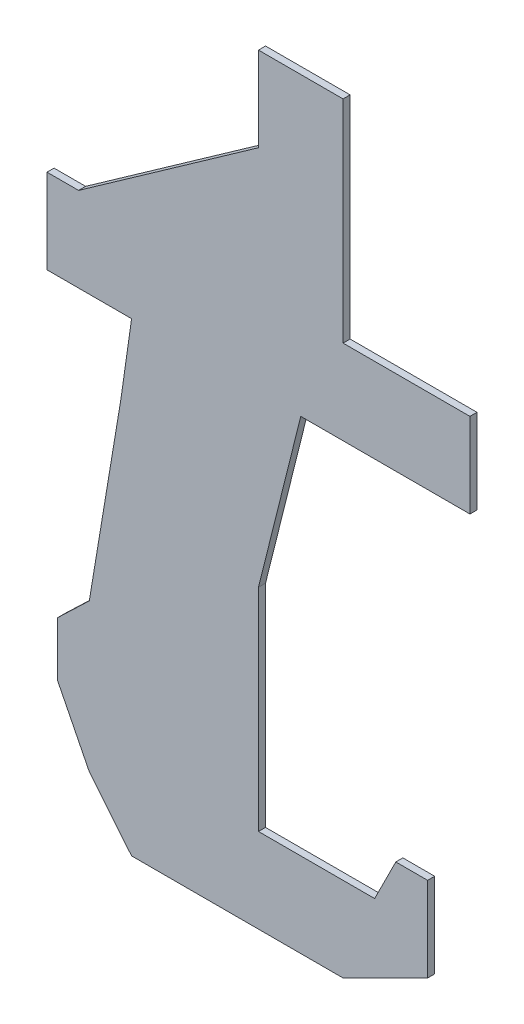
ISO-10303-21;
HEADER;
FILE_DESCRIPTION(('STEP AP214'),'2;1');
FILE_NAME('part.step','',(''),(''),'','','');
FILE_SCHEMA(('AUTOMOTIVE_DESIGN { 1 0 10303 214 1 1 1 1 }'));
ENDSEC;
DATA;
#1=APPLICATION_CONTEXT('core data for automotive mechanical design processes');
#2=APPLICATION_PROTOCOL_DEFINITION('international standard','automotive_design',2000,#1);
#3=PRODUCT_CONTEXT('',#1,'mechanical');
#4=PRODUCT('Part','Part','',(#3));
#5=PRODUCT_RELATED_PRODUCT_CATEGORY('part','',(#4));
#6=PRODUCT_DEFINITION_FORMATION('','',#4);
#7=PRODUCT_DEFINITION_CONTEXT('part definition',#1,'design');
#8=PRODUCT_DEFINITION('design','',#6,#7);
#9=PRODUCT_DEFINITION_SHAPE('','',#8);
#10=(LENGTH_UNIT() NAMED_UNIT(*) SI_UNIT(.MILLI.,.METRE.));
#11=(NAMED_UNIT(*) PLANE_ANGLE_UNIT() SI_UNIT($,.RADIAN.));
#12=(NAMED_UNIT(*) SI_UNIT($,.STERADIAN.) SOLID_ANGLE_UNIT());
#13=UNCERTAINTY_MEASURE_WITH_UNIT(LENGTH_MEASURE(1.E-05),#10,'distance_accuracy_value','');
#14=(GEOMETRIC_REPRESENTATION_CONTEXT(3) GLOBAL_UNCERTAINTY_ASSIGNED_CONTEXT((#13)) GLOBAL_UNIT_ASSIGNED_CONTEXT((#10,
#11,#12)) REPRESENTATION_CONTEXT('',''));
#15=CARTESIAN_POINT('',(0.,0.,0.));
#16=DIRECTION('',(0.,0.,1.));
#17=DIRECTION('',(1.,0.,0.));
#18=AXIS2_PLACEMENT_3D('',#15,#16,#17);
#19=CARTESIAN_POINT('',(-0.2999994,0.24000206,0.01));
#20=DIRECTION('',(0.,0.,-1.));
#21=DIRECTION('',(-1.,0.,0.));
#22=AXIS2_PLACEMENT_3D('',#19,#20,#21);
#23=PLANE('',#22);
#24=DIRECTION('',(1.,0.,0.));
#25=VECTOR('',#24,1.);
#26=CARTESIAN_POINT('',(-0.17999964,0.1200023,0.01));
#27=LINE('',#26,#25);
#28=CARTESIAN_POINT('',(-0.179999639999993,0.120002299999999,0.01));
#29=VERTEX_POINT('',#28);
#30=CARTESIAN_POINT('',(-0.2999994,0.1200023,0.01));
#31=VERTEX_POINT('',#30);
#32=EDGE_CURVE('E299',#29,#31,#27,.F.);
#33=ORIENTED_EDGE('',*,*,#32,.F.);
#34=DIRECTION('',(-0.140896511006019,-0.990024329593132,0.));
#35=VECTOR('',#34,1.);
#36=CARTESIAN_POINT('',(-0.19517868,0.01334516,0.01));
#37=LINE('',#36,#35);
#38=CARTESIAN_POINT('',(-0.195178679999948,0.0133451599999928,0.01));
#39=VERTEX_POINT('',#38);
#40=EDGE_CURVE('E294',#39,#29,#37,.F.);
#41=ORIENTED_EDGE('',*,*,#40,.F.);
#42=DIRECTION('',(-0.163760866877965,-0.98650006511879,0.));
#43=VECTOR('',#42,1.);
#44=CARTESIAN_POINT('',(-0.23999952,-0.25665684,0.01));
#45=LINE('',#44,#43);
#46=CARTESIAN_POINT('',(-0.239999519999992,-0.256656840000009,0.01));
#47=VERTEX_POINT('',#46);
#48=EDGE_CURVE('E289',#47,#39,#45,.F.);
#49=ORIENTED_EDGE('',*,*,#48,.F.);
#50=DIRECTION('',(-0.721641037230073,-0.69226744354007,0.));
#51=VECTOR('',#50,1.);
#52=CARTESIAN_POINT('',(-0.2851785,-0.29999686,0.01));
#53=LINE('',#52,#51);
#54=CARTESIAN_POINT('',(-0.2851785,-0.29999686,0.01));
#55=VERTEX_POINT('',#54);
#56=EDGE_CURVE('E284',#55,#47,#53,.F.);
#57=ORIENTED_EDGE('',*,*,#56,.F.);
#58=DIRECTION('',(0.,1.,0.));
#59=VECTOR('',#58,1.);
#60=CARTESIAN_POINT('',(-0.2851785,-0.3766566,0.01));
#61=LINE('',#60,#59);
#62=CARTESIAN_POINT('',(-0.285178500000013,-0.376656600000007,0.01));
#63=VERTEX_POINT('',#62);
#64=EDGE_CURVE('E279',#63,#55,#61,.T.);
#65=ORIENTED_EDGE('',*,*,#64,.F.);
#66=DIRECTION('',(0.448635588317927,-0.893714780505855,0.));
#67=VECTOR('',#66,1.);
#68=CARTESIAN_POINT('',(-0.23999952,-0.46665642,0.01));
#69=LINE('',#68,#67);
#70=CARTESIAN_POINT('',(-0.239999519999991,-0.466656419999993,0.01));
#71=VERTEX_POINT('',#70);
#72=EDGE_CURVE('E274',#71,#63,#69,.F.);
#73=ORIENTED_EDGE('',*,*,#72,.F.);
#74=DIRECTION('',(0.63318961950418,-0.773996709135221,0.));
#75=VECTOR('',#74,1.);
#76=CARTESIAN_POINT('',(-0.17999964,-0.53999892,0.01));
#77=LINE('',#76,#75);
#78=CARTESIAN_POINT('',(-0.17999964,-0.53999892,0.01));
#79=VERTEX_POINT('',#78);
#80=EDGE_CURVE('E269',#79,#71,#77,.F.);
#81=ORIENTED_EDGE('',*,*,#80,.F.);
#82=DIRECTION('',(1.,0.,0.));
#83=VECTOR('',#82,1.);
#84=CARTESIAN_POINT('',(0.11999976,-0.53999892,0.01));
#85=LINE('',#84,#83);
#86=CARTESIAN_POINT('',(0.119999759999993,-0.539998919999986,0.01));
#87=VERTEX_POINT('',#86);
#88=EDGE_CURVE('E264',#87,#79,#85,.F.);
#89=ORIENTED_EDGE('',*,*,#88,.F.);
#90=DIRECTION('',(0.894430977319859,0.447206022779929,0.));
#91=VECTOR('',#90,1.);
#92=CARTESIAN_POINT('',(0.24000206,-0.47999904,0.01));
#93=LINE('',#92,#91);
#94=CARTESIAN_POINT('',(0.24000206,-0.47999904,0.01));
#95=VERTEX_POINT('',#94);
#96=EDGE_CURVE('E259',#95,#87,#93,.F.);
#97=ORIENTED_EDGE('',*,*,#96,.F.);
#98=DIRECTION('',(0.,1.,0.));
#99=VECTOR('',#98,1.);
#100=CARTESIAN_POINT('',(0.24000206,-0.35999928,0.01));
#101=LINE('',#100,#99);
#102=CARTESIAN_POINT('',(0.24000206,-0.35999928,0.01));
#103=VERTEX_POINT('',#102);
#104=EDGE_CURVE('E254',#103,#95,#101,.F.);
#105=ORIENTED_EDGE('',*,*,#104,.F.);
#106=DIRECTION('',(1.,0.,0.));
#107=VECTOR('',#106,1.);
#108=CARTESIAN_POINT('',(0.19482054,-0.35999928,0.01));
#109=LINE('',#108,#107);
#110=CARTESIAN_POINT('',(0.19482054,-0.35999928,0.01));
#111=VERTEX_POINT('',#110);
#112=EDGE_CURVE('E249',#111,#103,#109,.T.);
#113=ORIENTED_EDGE('',*,*,#112,.F.);
#114=DIRECTION('',(-0.447213595499958,-0.894427190999916,0.));
#115=VECTOR('',#114,1.);
#116=CARTESIAN_POINT('',(0.1648206,-0.41999916,0.01));
#117=LINE('',#116,#115);
#118=CARTESIAN_POINT('',(0.1648206,-0.41999916,0.01));
#119=VERTEX_POINT('',#118);
#120=EDGE_CURVE('E244',#119,#111,#117,.F.);
#121=ORIENTED_EDGE('',*,*,#120,.F.);
#122=DIRECTION('',(1.,0.,0.));
#123=VECTOR('',#122,1.);
#124=CARTESIAN_POINT('',(0.,-0.41999916,0.01));
#125=LINE('',#124,#123);
#126=CARTESIAN_POINT('',(0.,-0.41999916,0.01));
#127=VERTEX_POINT('',#126);
#128=EDGE_CURVE('E239',#127,#119,#125,.T.);
#129=ORIENTED_EDGE('',*,*,#128,.F.);
#130=DIRECTION('',(0.,1.,0.));
#131=VECTOR('',#130,1.);
#132=CARTESIAN_POINT('',(0.,-0.11999722,0.01));
#133=LINE('',#132,#131);
#134=CARTESIAN_POINT('',(0.,-0.119997220000006,0.01));
#135=VERTEX_POINT('',#134);
#136=EDGE_CURVE('E234',#135,#127,#133,.F.);
#137=ORIENTED_EDGE('',*,*,#136,.F.);
#138=DIRECTION('',(0.242535625036098,0.970142500145391,0.));
#139=VECTOR('',#138,1.);
#140=CARTESIAN_POINT('',(0.05999987999999,0.1200023,0.01));
#141=LINE('',#140,#139);
#142=CARTESIAN_POINT('',(0.05999987999999,0.1200023,0.01));
#143=VERTEX_POINT('',#142);
#144=EDGE_CURVE('E229',#143,#135,#141,.F.);
#145=ORIENTED_EDGE('',*,*,#144,.F.);
#146=DIRECTION('',(1.,0.,0.));
#147=VECTOR('',#146,1.);
#148=CARTESIAN_POINT('',(0.30000194,0.1200023,0.01));
#149=LINE('',#148,#147);
#150=CARTESIAN_POINT('',(0.30000194,0.1200023,0.01));
#151=VERTEX_POINT('',#150);
#152=EDGE_CURVE('E224',#151,#143,#149,.F.);
#153=ORIENTED_EDGE('',*,*,#152,.F.);
#154=DIRECTION('',(0.,1.,0.));
#155=VECTOR('',#154,1.);
#156=CARTESIAN_POINT('',(0.30000194,0.24000206,0.01));
#157=LINE('',#156,#155);
#158=CARTESIAN_POINT('',(0.30000194,0.24000206,0.01));
#159=VERTEX_POINT('',#158);
#160=EDGE_CURVE('E219',#159,#151,#157,.F.);
#161=ORIENTED_EDGE('',*,*,#160,.F.);
#162=DIRECTION('',(1.,0.,0.));
#163=VECTOR('',#162,1.);
#164=CARTESIAN_POINT('',(0.11999976,0.24000206,0.01));
#165=LINE('',#164,#163);
#166=CARTESIAN_POINT('',(0.11999976,0.24000206,0.01));
#167=VERTEX_POINT('',#166);
#168=EDGE_CURVE('E214',#167,#159,#165,.T.);
#169=ORIENTED_EDGE('',*,*,#168,.F.);
#170=DIRECTION('',(0.,1.,0.));
#171=VECTOR('',#170,1.);
#172=CARTESIAN_POINT('',(0.11999976,0.54000146,0.01));
#173=LINE('',#172,#171);
#174=CARTESIAN_POINT('',(0.11999976,0.54000146,0.01));
#175=VERTEX_POINT('',#174);
#176=EDGE_CURVE('E209',#175,#167,#173,.F.);
#177=ORIENTED_EDGE('',*,*,#176,.F.);
#178=DIRECTION('',(1.,0.,0.));
#179=VECTOR('',#178,1.);
#180=CARTESIAN_POINT('',(0.,0.54000146,0.01));
#181=LINE('',#180,#179);
#182=CARTESIAN_POINT('',(0.,0.54000146,0.01));
#183=VERTEX_POINT('',#182);
#184=EDGE_CURVE('E204',#183,#175,#181,.T.);
#185=ORIENTED_EDGE('',*,*,#184,.F.);
#186=DIRECTION('',(0.,1.,0.));
#187=VECTOR('',#186,1.);
#188=CARTESIAN_POINT('',(0.,0.4200017,0.01));
#189=LINE('',#188,#187);
#190=CARTESIAN_POINT('',(0.,0.42000169999992,0.01));
#191=VERTEX_POINT('',#190);
#192=EDGE_CURVE('E190',#191,#183,#189,.T.);
#193=ORIENTED_EDGE('',*,*,#192,.F.);
#194=DIRECTION('',(-0.817158522488972,-0.57641300221598,0.));
#195=VECTOR('',#194,1.);
#196=CARTESIAN_POINT('',(-0.25517856,0.24000206,0.01));
#197=LINE('',#196,#195);
#198=CARTESIAN_POINT('',(-0.25517856,0.24000206,0.01));
#199=VERTEX_POINT('',#198);
#200=EDGE_CURVE('E175',#199,#191,#197,.F.);
#201=ORIENTED_EDGE('',*,*,#200,.F.);
#202=DIRECTION('',(1.,0.,0.));
#203=VECTOR('',#202,1.);
#204=CARTESIAN_POINT('',(-0.2999994,0.24000206,0.01));
#205=LINE('',#204,#203);
#206=CARTESIAN_POINT('',(-0.2999994,0.24000206,0.01));
#207=VERTEX_POINT('',#206);
#208=EDGE_CURVE('E20',#207,#199,#205,.T.);
#209=ORIENTED_EDGE('',*,*,#208,.F.);
#210=DIRECTION('',(0.,1.,0.));
#211=VECTOR('',#210,1.);
#212=CARTESIAN_POINT('',(-0.2999994,0.1200023,0.01));
#213=LINE('',#212,#211);
#214=EDGE_CURVE('E302',#31,#207,#213,.T.);
#215=ORIENTED_EDGE('',*,*,#214,.F.);
#216=EDGE_LOOP('',(#33,#41,#49,#57,#65,#73,#81,#89,#97,#105,#113,#121,#129,#137,#145,#153,#161,
#169,#177,#185,#193,#201,#209,#215));
#217=FACE_BOUND('',#216,.T.);
#218=ADVANCED_FACE('F17',(#217),#23,.F.);
#219=CARTESIAN_POINT('',(-0.2999994,0.24000206,0.));
#220=DIRECTION('',(0.,1.,0.));
#221=DIRECTION('',(0.,0.,1.));
#222=AXIS2_PLACEMENT_3D('',#219,#220,#221);
#223=PLANE('',#222);
#224=DIRECTION('',(0.,0.,1.));
#225=VECTOR('',#224,1.);
#226=CARTESIAN_POINT('',(-0.25517856,0.24000206,0.));
#227=LINE('',#226,#225);
#228=CARTESIAN_POINT('',(-0.25517856,0.24000206,0.));
#229=VERTEX_POINT('',#228);
#230=EDGE_CURVE('E181',#229,#199,#227,.T.);
#231=ORIENTED_EDGE('',*,*,#230,.F.);
#232=DIRECTION('',(-1.,0.,0.));
#233=VECTOR('',#232,1.);
#234=CARTESIAN_POINT('',(-0.2999994,0.24000206,0.));
#235=LINE('',#234,#233);
#236=CARTESIAN_POINT('',(-0.2999994,0.24000206,0.));
#237=VERTEX_POINT('',#236);
#238=EDGE_CURVE('E305',#237,#229,#235,.F.);
#239=ORIENTED_EDGE('',*,*,#238,.F.);
#240=DIRECTION('',(0.,0.,1.));
#241=VECTOR('',#240,1.);
#242=CARTESIAN_POINT('',(-0.2999994,0.24000206,0.));
#243=LINE('',#242,#241);
#244=EDGE_CURVE('E184',#207,#237,#243,.F.);
#245=ORIENTED_EDGE('',*,*,#244,.F.);
#246=ORIENTED_EDGE('',*,*,#208,.T.);
#247=EDGE_LOOP('',(#231,#239,#245,#246));
#248=FACE_BOUND('',#247,.T.);
#249=ADVANCED_FACE('F180',(#248),#223,.T.);
#250=CARTESIAN_POINT('',(-0.25517856,0.24000206,0.));
#251=DIRECTION('',(-0.57641300221598,0.817158522488972,0.));
#252=DIRECTION('',(-0.817158522488972,-0.57641300221598,0.));
#253=AXIS2_PLACEMENT_3D('',#250,#251,#252);
#254=PLANE('',#253);
#255=DIRECTION('',(0.,0.,1.));
#256=VECTOR('',#255,1.);
#257=CARTESIAN_POINT('',(0.,0.4200017,0.));
#258=LINE('',#257,#256);
#259=CARTESIAN_POINT('',(0.,0.42000169999992,0.));
#260=VERTEX_POINT('',#259);
#261=EDGE_CURVE('E192',#260,#191,#258,.T.);
#262=ORIENTED_EDGE('',*,*,#261,.F.);
#263=DIRECTION('',(0.81715852248861,0.576413002216494,0.));
#264=VECTOR('',#263,1.);
#265=CARTESIAN_POINT('',(-0.25517856,0.24000206,0.));
#266=LINE('',#265,#264);
#267=EDGE_CURVE('E196',#229,#260,#266,.T.);
#268=ORIENTED_EDGE('',*,*,#267,.F.);
#269=ORIENTED_EDGE('',*,*,#230,.T.);
#270=ORIENTED_EDGE('',*,*,#200,.T.);
#271=EDGE_LOOP('',(#262,#268,#269,#270));
#272=FACE_BOUND('',#271,.T.);
#273=ADVANCED_FACE('F194',(#272),#254,.T.);
#274=CARTESIAN_POINT('',(0.,0.4200017,0.));
#275=DIRECTION('',(-1.,0.,0.));
#276=DIRECTION('',(0.,0.,1.));
#277=AXIS2_PLACEMENT_3D('',#274,#275,#276);
#278=PLANE('',#277);
#279=DIRECTION('',(0.,0.,1.));
#280=VECTOR('',#279,1.);
#281=CARTESIAN_POINT('',(0.,0.54000146,0.));
#282=LINE('',#281,#280);
#283=CARTESIAN_POINT('',(0.,0.54000146,0.));
#284=VERTEX_POINT('',#283);
#285=EDGE_CURVE('E201',#284,#183,#282,.T.);
#286=ORIENTED_EDGE('',*,*,#285,.F.);
#287=DIRECTION('',(0.,1.,0.));
#288=VECTOR('',#287,1.);
#289=CARTESIAN_POINT('',(0.,0.24000206,0.));
#290=LINE('',#289,#288);
#291=EDGE_CURVE('E308',#260,#284,#290,.T.);
#292=ORIENTED_EDGE('',*,*,#291,.F.);
#293=ORIENTED_EDGE('',*,*,#261,.T.);
#294=ORIENTED_EDGE('',*,*,#192,.T.);
#295=EDGE_LOOP('',(#286,#292,#293,#294));
#296=FACE_BOUND('',#295,.T.);
#297=ADVANCED_FACE('F462',(#296),#278,.T.);
#298=CARTESIAN_POINT('',(0.,0.54000146,0.));
#299=DIRECTION('',(0.,1.,0.));
#300=DIRECTION('',(0.,0.,1.));
#301=AXIS2_PLACEMENT_3D('',#298,#299,#300);
#302=PLANE('',#301);
#303=DIRECTION('',(0.,0.,-1.));
#304=VECTOR('',#303,1.);
#305=CARTESIAN_POINT('',(0.11999976,0.54000146,0.));
#306=LINE('',#305,#304);
#307=CARTESIAN_POINT('',(0.11999976,0.54000146,0.));
#308=VERTEX_POINT('',#307);
#309=EDGE_CURVE('E206',#308,#175,#306,.F.);
#310=ORIENTED_EDGE('',*,*,#309,.F.);
#311=DIRECTION('',(-1.,0.,0.));
#312=VECTOR('',#311,1.);
#313=CARTESIAN_POINT('',(-0.2999994,0.54000146,0.));
#314=LINE('',#313,#312);
#315=EDGE_CURVE('E311',#284,#308,#314,.F.);
#316=ORIENTED_EDGE('',*,*,#315,.F.);
#317=ORIENTED_EDGE('',*,*,#285,.T.);
#318=ORIENTED_EDGE('',*,*,#184,.T.);
#319=EDGE_LOOP('',(#310,#316,#317,#318));
#320=FACE_BOUND('',#319,.T.);
#321=ADVANCED_FACE('F458',(#320),#302,.T.);
#322=CARTESIAN_POINT('',(0.11999976,0.54000146,0.));
#323=DIRECTION('',(1.,0.,0.));
#324=DIRECTION('',(0.,0.,-1.));
#325=AXIS2_PLACEMENT_3D('',#322,#323,#324);
#326=PLANE('',#325);
#327=DIRECTION('',(0.,0.,1.));
#328=VECTOR('',#327,1.);
#329=CARTESIAN_POINT('',(0.11999976,0.24000206,0.));
#330=LINE('',#329,#328);
#331=CARTESIAN_POINT('',(0.11999976,0.24000206,0.));
#332=VERTEX_POINT('',#331);
#333=EDGE_CURVE('E211',#332,#167,#330,.T.);
#334=ORIENTED_EDGE('',*,*,#333,.F.);
#335=DIRECTION('',(0.,1.,0.));
#336=VECTOR('',#335,1.);
#337=CARTESIAN_POINT('',(0.11999976,0.24000206,0.));
#338=LINE('',#337,#336);
#339=EDGE_CURVE('E314',#308,#332,#338,.F.);
#340=ORIENTED_EDGE('',*,*,#339,.F.);
#341=ORIENTED_EDGE('',*,*,#309,.T.);
#342=ORIENTED_EDGE('',*,*,#176,.T.);
#343=EDGE_LOOP('',(#334,#340,#341,#342));
#344=FACE_BOUND('',#343,.T.);
#345=ADVANCED_FACE('F454',(#344),#326,.T.);
#346=CARTESIAN_POINT('',(0.11999976,0.24000206,0.));
#347=DIRECTION('',(0.,1.,0.));
#348=DIRECTION('',(0.,0.,1.));
#349=AXIS2_PLACEMENT_3D('',#346,#347,#348);
#350=PLANE('',#349);
#351=DIRECTION('',(0.,0.,-1.));
#352=VECTOR('',#351,1.);
#353=CARTESIAN_POINT('',(0.30000194,0.24000206,0.));
#354=LINE('',#353,#352);
#355=CARTESIAN_POINT('',(0.30000194,0.24000206,0.));
#356=VERTEX_POINT('',#355);
#357=EDGE_CURVE('E216',#356,#159,#354,.F.);
#358=ORIENTED_EDGE('',*,*,#357,.F.);
#359=DIRECTION('',(-1.,0.,0.));
#360=VECTOR('',#359,1.);
#361=CARTESIAN_POINT('',(-0.2999994,0.24000206,0.));
#362=LINE('',#361,#360);
#363=EDGE_CURVE('E317',#332,#356,#362,.F.);
#364=ORIENTED_EDGE('',*,*,#363,.F.);
#365=ORIENTED_EDGE('',*,*,#333,.T.);
#366=ORIENTED_EDGE('',*,*,#168,.T.);
#367=EDGE_LOOP('',(#358,#364,#365,#366));
#368=FACE_BOUND('',#367,.T.);
#369=ADVANCED_FACE('F450',(#368),#350,.T.);
#370=CARTESIAN_POINT('',(0.30000194,0.24000206,0.));
#371=DIRECTION('',(1.,0.,0.));
#372=DIRECTION('',(0.,0.,-1.));
#373=AXIS2_PLACEMENT_3D('',#370,#371,#372);
#374=PLANE('',#373);
#375=DIRECTION('',(0.,0.,-1.));
#376=VECTOR('',#375,1.);
#377=CARTESIAN_POINT('',(0.30000194,0.1200023,0.));
#378=LINE('',#377,#376);
#379=CARTESIAN_POINT('',(0.30000194,0.1200023,0.));
#380=VERTEX_POINT('',#379);
#381=EDGE_CURVE('E221',#380,#151,#378,.F.);
#382=ORIENTED_EDGE('',*,*,#381,.F.);
#383=DIRECTION('',(0.,1.,0.));
#384=VECTOR('',#383,1.);
#385=CARTESIAN_POINT('',(0.30000194,0.24000206,0.));
#386=LINE('',#385,#384);
#387=EDGE_CURVE('E320',#356,#380,#386,.F.);
#388=ORIENTED_EDGE('',*,*,#387,.F.);
#389=ORIENTED_EDGE('',*,*,#357,.T.);
#390=ORIENTED_EDGE('',*,*,#160,.T.);
#391=EDGE_LOOP('',(#382,#388,#389,#390));
#392=FACE_BOUND('',#391,.T.);
#393=ADVANCED_FACE('F446',(#392),#374,.T.);
#394=CARTESIAN_POINT('',(0.30000194,0.1200023,0.));
#395=DIRECTION('',(0.,-1.,0.));
#396=DIRECTION('',(0.,0.,-1.));
#397=AXIS2_PLACEMENT_3D('',#394,#395,#396);
#398=PLANE('',#397);
#399=DIRECTION('',(0.,0.,1.));
#400=VECTOR('',#399,1.);
#401=CARTESIAN_POINT('',(0.05999987999999,0.1200023,0.));
#402=LINE('',#401,#400);
#403=CARTESIAN_POINT('',(0.05999987999999,0.1200023,0.));
#404=VERTEX_POINT('',#403);
#405=EDGE_CURVE('E226',#404,#143,#402,.T.);
#406=ORIENTED_EDGE('',*,*,#405,.F.);
#407=DIRECTION('',(-1.,0.,0.));
#408=VECTOR('',#407,1.);
#409=CARTESIAN_POINT('',(-0.2999994,0.1200023,0.));
#410=LINE('',#409,#408);
#411=EDGE_CURVE('E323',#380,#404,#410,.T.);
#412=ORIENTED_EDGE('',*,*,#411,.F.);
#413=ORIENTED_EDGE('',*,*,#381,.T.);
#414=ORIENTED_EDGE('',*,*,#152,.T.);
#415=EDGE_LOOP('',(#406,#412,#413,#414));
#416=FACE_BOUND('',#415,.T.);
#417=ADVANCED_FACE('F442',(#416),#398,.T.);
#418=CARTESIAN_POINT('',(0.05999987999999,0.1200023,0.));
#419=DIRECTION('',(0.970142500145391,-0.242535625036098,0.));
#420=DIRECTION('',(0.242535625036098,0.970142500145391,0.));
#421=AXIS2_PLACEMENT_3D('',#418,#419,#420);
#422=PLANE('',#421);
#423=DIRECTION('',(0.,0.,-1.));
#424=VECTOR('',#423,1.);
#425=CARTESIAN_POINT('',(0.,-0.11999722,0.));
#426=LINE('',#425,#424);
#427=CARTESIAN_POINT('',(0.,-0.119997220000006,0.));
#428=VERTEX_POINT('',#427);
#429=EDGE_CURVE('E231',#428,#135,#426,.F.);
#430=ORIENTED_EDGE('',*,*,#429,.F.);
#431=DIRECTION('',(-0.242535625036295,-0.970142500145341,0.));
#432=VECTOR('',#431,1.);
#433=CARTESIAN_POINT('',(0.05999987999999,0.1200023,0.));
#434=LINE('',#433,#432);
#435=EDGE_CURVE('E326',#404,#428,#434,.T.);
#436=ORIENTED_EDGE('',*,*,#435,.F.);
#437=ORIENTED_EDGE('',*,*,#405,.T.);
#438=ORIENTED_EDGE('',*,*,#144,.T.);
#439=EDGE_LOOP('',(#430,#436,#437,#438));
#440=FACE_BOUND('',#439,.T.);
#441=ADVANCED_FACE('F438',(#440),#422,.T.);
#442=CARTESIAN_POINT('',(0.,-0.11999722,0.));
#443=DIRECTION('',(1.,0.,0.));
#444=DIRECTION('',(0.,0.,-1.));
#445=AXIS2_PLACEMENT_3D('',#442,#443,#444);
#446=PLANE('',#445);
#447=DIRECTION('',(0.,0.,1.));
#448=VECTOR('',#447,1.);
#449=CARTESIAN_POINT('',(0.,-0.41999916,0.));
#450=LINE('',#449,#448);
#451=CARTESIAN_POINT('',(0.,-0.41999916,0.));
#452=VERTEX_POINT('',#451);
#453=EDGE_CURVE('E236',#452,#127,#450,.T.);
#454=ORIENTED_EDGE('',*,*,#453,.F.);
#455=DIRECTION('',(0.,1.,0.));
#456=VECTOR('',#455,1.);
#457=CARTESIAN_POINT('',(0.,0.24000206,0.));
#458=LINE('',#457,#456);
#459=EDGE_CURVE('E329',#428,#452,#458,.F.);
#460=ORIENTED_EDGE('',*,*,#459,.F.);
#461=ORIENTED_EDGE('',*,*,#429,.T.);
#462=ORIENTED_EDGE('',*,*,#136,.T.);
#463=EDGE_LOOP('',(#454,#460,#461,#462));
#464=FACE_BOUND('',#463,.T.);
#465=ADVANCED_FACE('F434',(#464),#446,.T.);
#466=CARTESIAN_POINT('',(0.,-0.41999916,0.));
#467=DIRECTION('',(0.,1.,0.));
#468=DIRECTION('',(0.,0.,1.));
#469=AXIS2_PLACEMENT_3D('',#466,#467,#468);
#470=PLANE('',#469);
#471=DIRECTION('',(0.,0.,1.));
#472=VECTOR('',#471,1.);
#473=CARTESIAN_POINT('',(0.1648206,-0.41999916,0.));
#474=LINE('',#473,#472);
#475=CARTESIAN_POINT('',(0.1648206,-0.41999916,0.));
#476=VERTEX_POINT('',#475);
#477=EDGE_CURVE('E241',#476,#119,#474,.T.);
#478=ORIENTED_EDGE('',*,*,#477,.F.);
#479=DIRECTION('',(-1.,0.,0.));
#480=VECTOR('',#479,1.);
#481=CARTESIAN_POINT('',(-0.2999994,-0.41999916,0.));
#482=LINE('',#481,#480);
#483=EDGE_CURVE('E332',#452,#476,#482,.F.);
#484=ORIENTED_EDGE('',*,*,#483,.F.);
#485=ORIENTED_EDGE('',*,*,#453,.T.);
#486=ORIENTED_EDGE('',*,*,#128,.T.);
#487=EDGE_LOOP('',(#478,#484,#485,#486));
#488=FACE_BOUND('',#487,.T.);
#489=ADVANCED_FACE('F430',(#488),#470,.T.);
#490=CARTESIAN_POINT('',(0.1648206,-0.41999916,0.));
#491=DIRECTION('',(-0.894427190999916,0.447213595499958,0.));
#492=DIRECTION('',(-0.447213595499958,-0.894427190999916,0.));
#493=AXIS2_PLACEMENT_3D('',#490,#491,#492);
#494=PLANE('',#493);
#495=DIRECTION('',(0.,0.,1.));
#496=VECTOR('',#495,1.);
#497=CARTESIAN_POINT('',(0.19482054,-0.35999928,0.));
#498=LINE('',#497,#496);
#499=CARTESIAN_POINT('',(0.19482054,-0.35999928,0.));
#500=VERTEX_POINT('',#499);
#501=EDGE_CURVE('E246',#500,#111,#498,.T.);
#502=ORIENTED_EDGE('',*,*,#501,.F.);
#503=DIRECTION('',(0.447213595499957,0.894427190999917,0.));
#504=VECTOR('',#503,1.);
#505=CARTESIAN_POINT('',(0.1648206,-0.41999916,0.));
#506=LINE('',#505,#504);
#507=EDGE_CURVE('E335',#476,#500,#506,.T.);
#508=ORIENTED_EDGE('',*,*,#507,.F.);
#509=ORIENTED_EDGE('',*,*,#477,.T.);
#510=ORIENTED_EDGE('',*,*,#120,.T.);
#511=EDGE_LOOP('',(#502,#508,#509,#510));
#512=FACE_BOUND('',#511,.T.);
#513=ADVANCED_FACE('F426',(#512),#494,.T.);
#514=CARTESIAN_POINT('',(0.19482054,-0.35999928,0.));
#515=DIRECTION('',(0.,1.,0.));
#516=DIRECTION('',(0.,0.,1.));
#517=AXIS2_PLACEMENT_3D('',#514,#515,#516);
#518=PLANE('',#517);
#519=DIRECTION('',(0.,0.,-1.));
#520=VECTOR('',#519,1.);
#521=CARTESIAN_POINT('',(0.24000206,-0.35999928,0.));
#522=LINE('',#521,#520);
#523=CARTESIAN_POINT('',(0.24000206,-0.35999928,0.));
#524=VERTEX_POINT('',#523);
#525=EDGE_CURVE('E251',#524,#103,#522,.F.);
#526=ORIENTED_EDGE('',*,*,#525,.F.);
#527=DIRECTION('',(-1.,0.,0.));
#528=VECTOR('',#527,1.);
#529=CARTESIAN_POINT('',(-0.2999994,-0.35999928,0.));
#530=LINE('',#529,#528);
#531=EDGE_CURVE('E338',#500,#524,#530,.F.);
#532=ORIENTED_EDGE('',*,*,#531,.F.);
#533=ORIENTED_EDGE('',*,*,#501,.T.);
#534=ORIENTED_EDGE('',*,*,#112,.T.);
#535=EDGE_LOOP('',(#526,#532,#533,#534));
#536=FACE_BOUND('',#535,.T.);
#537=ADVANCED_FACE('F422',(#536),#518,.T.);
#538=CARTESIAN_POINT('',(0.24000206,-0.35999928,0.));
#539=DIRECTION('',(1.,0.,0.));
#540=DIRECTION('',(0.,0.,-1.));
#541=AXIS2_PLACEMENT_3D('',#538,#539,#540);
#542=PLANE('',#541);
#543=DIRECTION('',(0.,0.,1.));
#544=VECTOR('',#543,1.);
#545=CARTESIAN_POINT('',(0.24000206,-0.47999904,0.));
#546=LINE('',#545,#544);
#547=CARTESIAN_POINT('',(0.24000206,-0.47999904,0.));
#548=VERTEX_POINT('',#547);
#549=EDGE_CURVE('E256',#548,#95,#546,.T.);
#550=ORIENTED_EDGE('',*,*,#549,.F.);
#551=DIRECTION('',(0.,1.,0.));
#552=VECTOR('',#551,1.);
#553=CARTESIAN_POINT('',(0.24000206,0.24000206,0.));
#554=LINE('',#553,#552);
#555=EDGE_CURVE('E341',#524,#548,#554,.F.);
#556=ORIENTED_EDGE('',*,*,#555,.F.);
#557=ORIENTED_EDGE('',*,*,#525,.T.);
#558=ORIENTED_EDGE('',*,*,#104,.T.);
#559=EDGE_LOOP('',(#550,#556,#557,#558));
#560=FACE_BOUND('',#559,.T.);
#561=ADVANCED_FACE('F418',(#560),#542,.T.);
#562=CARTESIAN_POINT('',(0.24000206,-0.47999904,0.));
#563=DIRECTION('',(0.447206022779929,-0.894430977319859,0.));
#564=DIRECTION('',(0.894430977319859,0.447206022779929,0.));
#565=AXIS2_PLACEMENT_3D('',#562,#563,#564);
#566=PLANE('',#565);
#567=DIRECTION('',(0.,0.,-1.));
#568=VECTOR('',#567,1.);
#569=CARTESIAN_POINT('',(0.11999976,-0.53999892,0.));
#570=LINE('',#569,#568);
#571=CARTESIAN_POINT('',(0.119999759999993,-0.539998919999986,0.));
#572=VERTEX_POINT('',#571);
#573=EDGE_CURVE('E261',#572,#87,#570,.F.);
#574=ORIENTED_EDGE('',*,*,#573,.F.);
#575=DIRECTION('',(-0.894430977319757,-0.447206022780132,0.));
#576=VECTOR('',#575,1.);
#577=CARTESIAN_POINT('',(0.24000206,-0.47999904,0.));
#578=LINE('',#577,#576);
#579=EDGE_CURVE('E344',#548,#572,#578,.T.);
#580=ORIENTED_EDGE('',*,*,#579,.F.);
#581=ORIENTED_EDGE('',*,*,#549,.T.);
#582=ORIENTED_EDGE('',*,*,#96,.T.);
#583=EDGE_LOOP('',(#574,#580,#581,#582));
#584=FACE_BOUND('',#583,.T.);
#585=ADVANCED_FACE('F414',(#584),#566,.T.);
#586=CARTESIAN_POINT('',(0.11999976,-0.53999892,0.));
#587=DIRECTION('',(0.,-1.,0.));
#588=DIRECTION('',(0.,0.,-1.));
#589=AXIS2_PLACEMENT_3D('',#586,#587,#588);
#590=PLANE('',#589);
#591=DIRECTION('',(0.,0.,1.));
#592=VECTOR('',#591,1.);
#593=CARTESIAN_POINT('',(-0.17999964,-0.53999892,0.));
#594=LINE('',#593,#592);
#595=CARTESIAN_POINT('',(-0.17999964,-0.53999892,0.));
#596=VERTEX_POINT('',#595);
#597=EDGE_CURVE('E266',#596,#79,#594,.T.);
#598=ORIENTED_EDGE('',*,*,#597,.F.);
#599=DIRECTION('',(-1.,0.,0.));
#600=VECTOR('',#599,1.);
#601=CARTESIAN_POINT('',(-0.2999994,-0.53999892,0.));
#602=LINE('',#601,#600);
#603=EDGE_CURVE('E347',#572,#596,#602,.T.);
#604=ORIENTED_EDGE('',*,*,#603,.F.);
#605=ORIENTED_EDGE('',*,*,#573,.T.);
#606=ORIENTED_EDGE('',*,*,#88,.T.);
#607=EDGE_LOOP('',(#598,#604,#605,#606));
#608=FACE_BOUND('',#607,.T.);
#609=ADVANCED_FACE('F410',(#608),#590,.T.);
#610=CARTESIAN_POINT('',(-0.17999964,-0.53999892,0.));
#611=DIRECTION('',(-0.773996709135221,-0.63318961950418,0.));
#612=DIRECTION('',(0.63318961950418,-0.773996709135221,0.));
#613=AXIS2_PLACEMENT_3D('',#610,#611,#612);
#614=PLANE('',#613);
#615=DIRECTION('',(0.,0.,1.));
#616=VECTOR('',#615,1.);
#617=CARTESIAN_POINT('',(-0.23999952,-0.46665642,0.));
#618=LINE('',#617,#616);
#619=CARTESIAN_POINT('',(-0.239999519999991,-0.466656419999993,0.));
#620=VERTEX_POINT('',#619);
#621=EDGE_CURVE('E271',#620,#71,#618,.T.);
#622=ORIENTED_EDGE('',*,*,#621,.F.);
#623=DIRECTION('',(-0.633189619504366,0.773996709135069,0.));
#624=VECTOR('',#623,1.);
#625=CARTESIAN_POINT('',(-0.17999964,-0.53999892,0.));
#626=LINE('',#625,#624);
#627=EDGE_CURVE('E350',#596,#620,#626,.T.);
#628=ORIENTED_EDGE('',*,*,#627,.F.);
#629=ORIENTED_EDGE('',*,*,#597,.T.);
#630=ORIENTED_EDGE('',*,*,#80,.T.);
#631=EDGE_LOOP('',(#622,#628,#629,#630));
#632=FACE_BOUND('',#631,.T.);
#633=ADVANCED_FACE('F406',(#632),#614,.T.);
#634=CARTESIAN_POINT('',(-0.23999952,-0.46665642,0.));
#635=DIRECTION('',(-0.893714780505855,-0.448635588317927,0.));
#636=DIRECTION('',(0.448635588317927,-0.893714780505855,0.));
#637=AXIS2_PLACEMENT_3D('',#634,#635,#636);
#638=PLANE('',#637);
#639=DIRECTION('',(0.,0.,1.));
#640=VECTOR('',#639,1.);
#641=CARTESIAN_POINT('',(-0.2851785,-0.3766566,0.));
#642=LINE('',#641,#640);
#643=CARTESIAN_POINT('',(-0.285178500000013,-0.376656600000007,0.));
#644=VERTEX_POINT('',#643);
#645=EDGE_CURVE('E276',#644,#63,#642,.T.);
#646=ORIENTED_EDGE('',*,*,#645,.F.);
#647=DIRECTION('',(-0.448635588317668,0.893714780505984,0.));
#648=VECTOR('',#647,1.);
#649=CARTESIAN_POINT('',(-0.23999952,-0.46665642,0.));
#650=LINE('',#649,#648);
#651=EDGE_CURVE('E353',#620,#644,#650,.T.);
#652=ORIENTED_EDGE('',*,*,#651,.F.);
#653=ORIENTED_EDGE('',*,*,#621,.T.);
#654=ORIENTED_EDGE('',*,*,#72,.T.);
#655=EDGE_LOOP('',(#646,#652,#653,#654));
#656=FACE_BOUND('',#655,.T.);
#657=ADVANCED_FACE('F402',(#656),#638,.T.);
#658=CARTESIAN_POINT('',(-0.2851785,-0.3766566,0.));
#659=DIRECTION('',(-1.,0.,0.));
#660=DIRECTION('',(0.,0.,1.));
#661=AXIS2_PLACEMENT_3D('',#658,#659,#660);
#662=PLANE('',#661);
#663=DIRECTION('',(0.,0.,1.));
#664=VECTOR('',#663,1.);
#665=CARTESIAN_POINT('',(-0.2851785,-0.29999686,0.));
#666=LINE('',#665,#664);
#667=CARTESIAN_POINT('',(-0.2851785,-0.29999686,0.));
#668=VERTEX_POINT('',#667);
#669=EDGE_CURVE('E281',#668,#55,#666,.T.);
#670=ORIENTED_EDGE('',*,*,#669,.F.);
#671=DIRECTION('',(0.,1.,0.));
#672=VECTOR('',#671,1.);
#673=CARTESIAN_POINT('',(-0.2851785,0.24000206,0.));
#674=LINE('',#673,#672);
#675=EDGE_CURVE('E356',#644,#668,#674,.T.);
#676=ORIENTED_EDGE('',*,*,#675,.F.);
#677=ORIENTED_EDGE('',*,*,#645,.T.);
#678=ORIENTED_EDGE('',*,*,#64,.T.);
#679=EDGE_LOOP('',(#670,#676,#677,#678));
#680=FACE_BOUND('',#679,.T.);
#681=ADVANCED_FACE('F398',(#680),#662,.T.);
#682=CARTESIAN_POINT('',(-0.2851785,-0.29999686,0.));
#683=DIRECTION('',(-0.69226744354007,0.721641037230073,0.));
#684=DIRECTION('',(-0.721641037230073,-0.69226744354007,0.));
#685=AXIS2_PLACEMENT_3D('',#682,#683,#684);
#686=PLANE('',#685);
#687=DIRECTION('',(0.,0.,1.));
#688=VECTOR('',#687,1.);
#689=CARTESIAN_POINT('',(-0.23999952,-0.25665684,0.));
#690=LINE('',#689,#688);
#691=CARTESIAN_POINT('',(-0.239999519999992,-0.256656840000009,0.));
#692=VERTEX_POINT('',#691);
#693=EDGE_CURVE('E286',#692,#47,#690,.T.);
#694=ORIENTED_EDGE('',*,*,#693,.F.);
#695=DIRECTION('',(0.721641037229806,0.692267443540349,0.));
#696=VECTOR('',#695,1.);
#697=CARTESIAN_POINT('',(-0.2851785,-0.29999686,0.));
#698=LINE('',#697,#696);
#699=EDGE_CURVE('E359',#668,#692,#698,.T.);
#700=ORIENTED_EDGE('',*,*,#699,.F.);
#701=ORIENTED_EDGE('',*,*,#669,.T.);
#702=ORIENTED_EDGE('',*,*,#56,.T.);
#703=EDGE_LOOP('',(#694,#700,#701,#702));
#704=FACE_BOUND('',#703,.T.);
#705=ADVANCED_FACE('F394',(#704),#686,.T.);
#706=CARTESIAN_POINT('',(-0.23999952,-0.25665684,0.));
#707=DIRECTION('',(-0.98650006511879,0.163760866877965,0.));
#708=DIRECTION('',(-0.163760866877965,-0.98650006511879,0.));
#709=AXIS2_PLACEMENT_3D('',#706,#707,#708);
#710=PLANE('',#709);
#711=DIRECTION('',(0.,0.,1.));
#712=VECTOR('',#711,1.);
#713=CARTESIAN_POINT('',(-0.19517868,0.01334516,0.));
#714=LINE('',#713,#712);
#715=CARTESIAN_POINT('',(-0.195178679999948,0.0133451599999928,0.));
#716=VERTEX_POINT('',#715);
#717=EDGE_CURVE('E291',#716,#39,#714,.T.);
#718=ORIENTED_EDGE('',*,*,#717,.F.);
#719=DIRECTION('',(0.163760866877585,0.986500065118853,0.));
#720=VECTOR('',#719,1.);
#721=CARTESIAN_POINT('',(-0.23999952,-0.25665684,0.));
#722=LINE('',#721,#720);
#723=EDGE_CURVE('E362',#692,#716,#722,.T.);
#724=ORIENTED_EDGE('',*,*,#723,.F.);
#725=ORIENTED_EDGE('',*,*,#693,.T.);
#726=ORIENTED_EDGE('',*,*,#48,.T.);
#727=EDGE_LOOP('',(#718,#724,#725,#726));
#728=FACE_BOUND('',#727,.T.);
#729=ADVANCED_FACE('F391',(#728),#710,.T.);
#730=CARTESIAN_POINT('',(-0.19517868,0.01334516,0.));
#731=DIRECTION('',(-0.990024329593132,0.140896511006019,0.));
#732=DIRECTION('',(-0.140896511006019,-0.990024329593132,0.));
#733=AXIS2_PLACEMENT_3D('',#730,#731,#732);
#734=PLANE('',#733);
#735=DIRECTION('',(0.,0.,-1.));
#736=VECTOR('',#735,1.);
#737=CARTESIAN_POINT('',(-0.17999964,0.1200023,0.));
#738=LINE('',#737,#736);
#739=CARTESIAN_POINT('',(-0.179999639999993,0.120002299999999,0.));
#740=VERTEX_POINT('',#739);
#741=EDGE_CURVE('E296',#740,#29,#738,.F.);
#742=ORIENTED_EDGE('',*,*,#741,.F.);
#743=DIRECTION('',(0.140896511005898,0.990024329593149,0.));
#744=VECTOR('',#743,1.);
#745=CARTESIAN_POINT('',(-0.19517868,0.01334516,0.));
#746=LINE('',#745,#744);
#747=EDGE_CURVE('E365',#716,#740,#746,.T.);
#748=ORIENTED_EDGE('',*,*,#747,.F.);
#749=ORIENTED_EDGE('',*,*,#717,.T.);
#750=ORIENTED_EDGE('',*,*,#40,.T.);
#751=EDGE_LOOP('',(#742,#748,#749,#750));
#752=FACE_BOUND('',#751,.T.);
#753=ADVANCED_FACE('F374',(#752),#734,.T.);
#754=CARTESIAN_POINT('',(-0.17999964,0.1200023,0.));
#755=DIRECTION('',(0.,-1.,0.));
#756=DIRECTION('',(0.,0.,-1.));
#757=AXIS2_PLACEMENT_3D('',#754,#755,#756);
#758=PLANE('',#757);
#759=DIRECTION('',(0.,0.,1.));
#760=VECTOR('',#759,1.);
#761=CARTESIAN_POINT('',(-0.2999994,0.1200023,0.));
#762=LINE('',#761,#760);
#763=CARTESIAN_POINT('',(-0.2999994,0.1200023,0.));
#764=VERTEX_POINT('',#763);
#765=EDGE_CURVE('E35',#764,#31,#762,.T.);
#766=ORIENTED_EDGE('',*,*,#765,.F.);
#767=DIRECTION('',(-1.,0.,0.));
#768=VECTOR('',#767,1.);
#769=CARTESIAN_POINT('',(-0.2999994,0.1200023,0.));
#770=LINE('',#769,#768);
#771=EDGE_CURVE('E26',#740,#764,#770,.T.);
#772=ORIENTED_EDGE('',*,*,#771,.F.);
#773=ORIENTED_EDGE('',*,*,#741,.T.);
#774=ORIENTED_EDGE('',*,*,#32,.T.);
#775=EDGE_LOOP('',(#766,#772,#773,#774));
#776=FACE_BOUND('',#775,.T.);
#777=ADVANCED_FACE('F372',(#776),#758,.T.);
#778=CARTESIAN_POINT('',(-0.2999994,0.1200023,0.));
#779=DIRECTION('',(-1.,0.,0.));
#780=DIRECTION('',(0.,0.,1.));
#781=AXIS2_PLACEMENT_3D('',#778,#779,#780);
#782=PLANE('',#781);
#783=ORIENTED_EDGE('',*,*,#244,.T.);
#784=DIRECTION('',(0.,1.,0.));
#785=VECTOR('',#784,1.);
#786=CARTESIAN_POINT('',(-0.2999994,0.24000206,0.));
#787=LINE('',#786,#785);
#788=EDGE_CURVE('E11',#764,#237,#787,.T.);
#789=ORIENTED_EDGE('',*,*,#788,.F.);
#790=ORIENTED_EDGE('',*,*,#765,.T.);
#791=ORIENTED_EDGE('',*,*,#214,.T.);
#792=EDGE_LOOP('',(#783,#789,#790,#791));
#793=FACE_BOUND('',#792,.T.);
#794=ADVANCED_FACE('F378',(#793),#782,.T.);
#795=CARTESIAN_POINT('',(-0.2999994,0.24000206,0.));
#796=DIRECTION('',(0.,0.,-1.));
#797=DIRECTION('',(-1.,0.,0.));
#798=AXIS2_PLACEMENT_3D('',#795,#796,#797);
#799=PLANE('',#798);
#800=ORIENTED_EDGE('',*,*,#771,.T.);
#801=ORIENTED_EDGE('',*,*,#788,.T.);
#802=ORIENTED_EDGE('',*,*,#238,.T.);
#803=ORIENTED_EDGE('',*,*,#267,.T.);
#804=ORIENTED_EDGE('',*,*,#291,.T.);
#805=ORIENTED_EDGE('',*,*,#315,.T.);
#806=ORIENTED_EDGE('',*,*,#339,.T.);
#807=ORIENTED_EDGE('',*,*,#363,.T.);
#808=ORIENTED_EDGE('',*,*,#387,.T.);
#809=ORIENTED_EDGE('',*,*,#411,.T.);
#810=ORIENTED_EDGE('',*,*,#435,.T.);
#811=ORIENTED_EDGE('',*,*,#459,.T.);
#812=ORIENTED_EDGE('',*,*,#483,.T.);
#813=ORIENTED_EDGE('',*,*,#507,.T.);
#814=ORIENTED_EDGE('',*,*,#531,.T.);
#815=ORIENTED_EDGE('',*,*,#555,.T.);
#816=ORIENTED_EDGE('',*,*,#579,.T.);
#817=ORIENTED_EDGE('',*,*,#603,.T.);
#818=ORIENTED_EDGE('',*,*,#627,.T.);
#819=ORIENTED_EDGE('',*,*,#651,.T.);
#820=ORIENTED_EDGE('',*,*,#675,.T.);
#821=ORIENTED_EDGE('',*,*,#699,.T.);
#822=ORIENTED_EDGE('',*,*,#723,.T.);
#823=ORIENTED_EDGE('',*,*,#747,.T.);
#824=EDGE_LOOP('',(#800,#801,#802,#803,#804,#805,#806,#807,#808,#809,#810,#811,#812,#813,#814,
#815,#816,#817,#818,#819,#820,#821,#822,#823));
#825=FACE_BOUND('',#824,.T.);
#826=ADVANCED_FACE('F370',(#825),#799,.T.);
#827=CLOSED_SHELL('',(#218,#249,#273,#297,#321,#345,#369,#393,#417,#441,#465,#489,#513,#537,
#561,#585,#609,#633,#657,#681,#705,#729,#753,#777,#794,#826));
#828=MANIFOLD_SOLID_BREP('B1',#827);
#829=ADVANCED_BREP_SHAPE_REPRESENTATION('',(#18,#828),#14);
#830=SHAPE_DEFINITION_REPRESENTATION(#9,#829);
ENDSEC;
END-ISO-10303-21;
